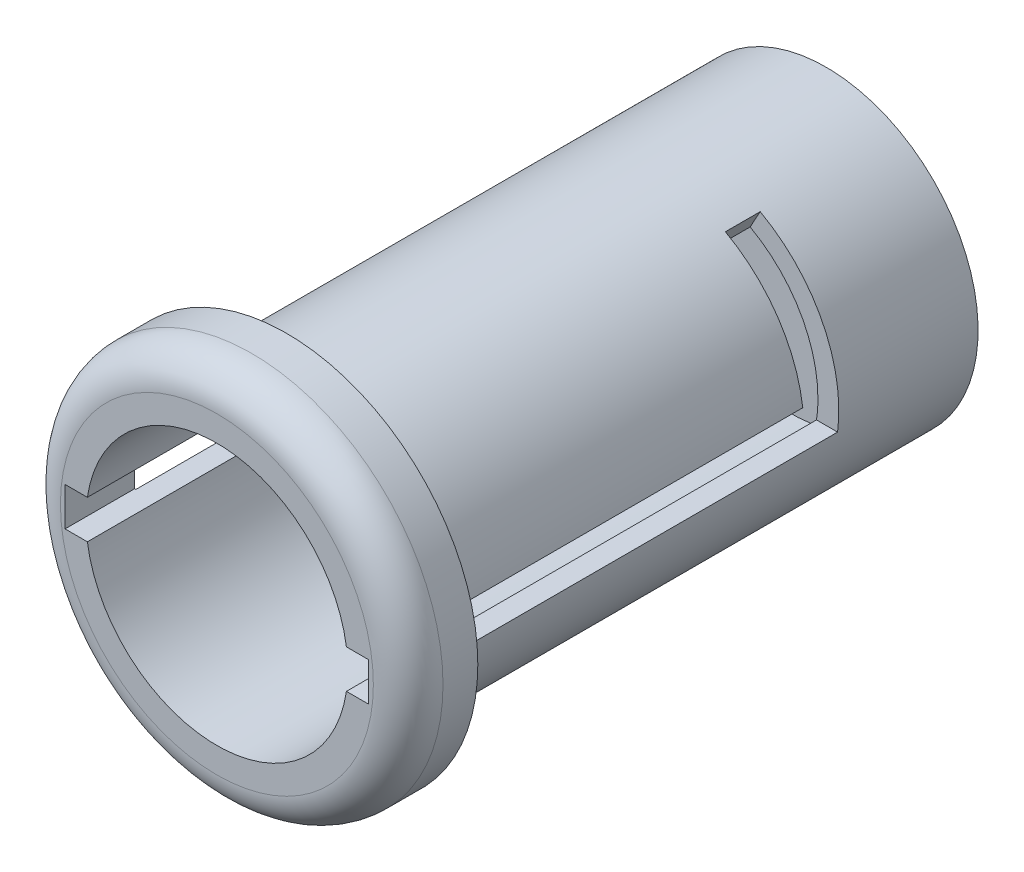
ISO-10303-21;
HEADER;
FILE_DESCRIPTION(('STEP AP214'),'2;1');
FILE_NAME('part.step','',(''),(''),'','','');
FILE_SCHEMA(('AUTOMOTIVE_DESIGN { 1 0 10303 214 1 1 1 1 }'));
ENDSEC;
DATA;
#1=APPLICATION_CONTEXT('core data for automotive mechanical design processes');
#2=APPLICATION_PROTOCOL_DEFINITION('international standard','automotive_design',2000,#1);
#3=PRODUCT_CONTEXT('',#1,'mechanical');
#4=PRODUCT('Part','Part','',(#3));
#5=PRODUCT_RELATED_PRODUCT_CATEGORY('part','',(#4));
#6=PRODUCT_DEFINITION_FORMATION('','',#4);
#7=PRODUCT_DEFINITION_CONTEXT('part definition',#1,'design');
#8=PRODUCT_DEFINITION('design','',#6,#7);
#9=PRODUCT_DEFINITION_SHAPE('','',#8);
#10=(LENGTH_UNIT() NAMED_UNIT(*) SI_UNIT(.MILLI.,.METRE.));
#11=(NAMED_UNIT(*) PLANE_ANGLE_UNIT() SI_UNIT($,.RADIAN.));
#12=(NAMED_UNIT(*) SI_UNIT($,.STERADIAN.) SOLID_ANGLE_UNIT());
#13=UNCERTAINTY_MEASURE_WITH_UNIT(LENGTH_MEASURE(1.E-05),#10,'distance_accuracy_value','');
#14=(GEOMETRIC_REPRESENTATION_CONTEXT(3) GLOBAL_UNCERTAINTY_ASSIGNED_CONTEXT((#13)) GLOBAL_UNIT_ASSIGNED_CONTEXT((#10,
#11,#12)) REPRESENTATION_CONTEXT('',''));
#15=CARTESIAN_POINT('',(0.,0.,0.));
#16=DIRECTION('',(0.,0.,1.));
#17=DIRECTION('',(1.,0.,0.));
#18=AXIS2_PLACEMENT_3D('',#15,#16,#17);
#19=CARTESIAN_POINT('',(-22.4709045039062,-26.2716583844857,-32.4096371527706));
#20=DIRECTION('',(0.,-1.,0.));
#21=DIRECTION('',(1.,0.,0.));
#22=AXIS2_PLACEMENT_3D('',#19,#20,#21);
#23=PLANE('',#22);
#24=DIRECTION('',(1.,0.,0.));
#25=VECTOR('',#24,1.);
#26=CARTESIAN_POINT('',(-22.4709045039062,-26.2716583844857,-25.5096371527706));
#27=LINE('',#26,#25);
#28=CARTESIAN_POINT('',(-23.9448998922446,-26.2716583844857,-25.5096371527706));
#29=VERTEX_POINT('',#28);
#30=CARTESIAN_POINT('',(-22.5518523622266,-26.2716583844857,-25.5096371527706));
#31=VERTEX_POINT('',#30);
#32=EDGE_CURVE('E168',#29,#31,#27,.T.);
#33=ORIENTED_EDGE('',*,*,#32,.F.);
#34=DIRECTION('',(0.,0.,1.));
#35=VECTOR('',#34,1.);
#36=CARTESIAN_POINT('',(-23.9448998922446,-26.2716583844857,-32.4096371527706));
#37=LINE('',#36,#35);
#38=CARTESIAN_POINT('',(-23.9448998922446,-26.2716583844857,5.54036284722943));
#39=VERTEX_POINT('',#38);
#40=EDGE_CURVE('E232',#39,#29,#37,.F.);
#41=ORIENTED_EDGE('',*,*,#40,.F.);
#42=DIRECTION('',(1.,0.,0.));
#43=VECTOR('',#42,1.);
#44=CARTESIAN_POINT('',(-22.4709045039062,-26.2716583844857,5.54036284722943));
#45=LINE('',#44,#43);
#46=CARTESIAN_POINT('',(-22.4709045039062,-26.2716583844857,5.54036284722943));
#47=VERTEX_POINT('',#46);
#48=EDGE_CURVE('E246',#39,#47,#45,.T.);
#49=ORIENTED_EDGE('',*,*,#48,.T.);
#50=DIRECTION('',(0.,0.,1.));
#51=VECTOR('',#50,1.);
#52=CARTESIAN_POINT('',(-22.4709045039062,-26.2716583844857,-32.4096371527706));
#53=LINE('',#52,#51);
#54=CARTESIAN_POINT('',(-22.4709045039062,-26.2716583844857,0.940362847229432));
#55=VERTEX_POINT('',#54);
#56=EDGE_CURVE('E268',#55,#47,#53,.T.);
#57=ORIENTED_EDGE('',*,*,#56,.F.);
#58=DIRECTION('',(1.,0.,0.));
#59=VECTOR('',#58,1.);
#60=CARTESIAN_POINT('',(-32.5,-26.2716583844857,0.940362847229432));
#61=LINE('',#60,#59);
#62=CARTESIAN_POINT('',(-22.5518523622266,-26.2716583844857,0.940362847229431));
#63=VERTEX_POINT('',#62);
#64=EDGE_CURVE('E200',#63,#55,#61,.T.);
#65=ORIENTED_EDGE('',*,*,#64,.F.);
#66=DIRECTION('',(0.,0.,1.));
#67=VECTOR('',#66,1.);
#68=CARTESIAN_POINT('',(-22.5518523622266,-26.2716583844857,-32.4096371527706));
#69=LINE('',#68,#67);
#70=EDGE_CURVE('E227',#63,#31,#69,.F.);
#71=ORIENTED_EDGE('',*,*,#70,.T.);
#72=EDGE_LOOP('',(#33,#41,#49,#57,#65,#71));
#73=FACE_BOUND('',#72,.T.);
#74=ADVANCED_FACE('F35',(#73),#23,.F.);
#75=CARTESIAN_POINT('',(-22.4709045039062,-23.7283416155143,-32.4096371527706));
#76=DIRECTION('',(0.,1.,0.));
#77=DIRECTION('',(0.,0.,1.));
#78=AXIS2_PLACEMENT_3D('',#75,#76,#77);
#79=PLANE('',#78);
#80=DIRECTION('',(-1.,0.,0.));
#81=VECTOR('',#80,1.);
#82=CARTESIAN_POINT('',(-22.4709045039062,-23.7283416155143,-25.5096371527706));
#83=LINE('',#82,#81);
#84=CARTESIAN_POINT('',(-41.0551001077554,-23.7283416155143,-25.5096371527706));
#85=VERTEX_POINT('',#84);
#86=CARTESIAN_POINT('',(-42.4481476377734,-23.7283416155143,-25.5096371527706));
#87=VERTEX_POINT('',#86);
#88=EDGE_CURVE('E153',#85,#87,#83,.T.);
#89=ORIENTED_EDGE('',*,*,#88,.F.);
#90=DIRECTION('',(0.,0.,1.));
#91=VECTOR('',#90,1.);
#92=CARTESIAN_POINT('',(-41.0551001077554,-23.7283416155143,-32.4096371527706));
#93=LINE('',#92,#91);
#94=CARTESIAN_POINT('',(-41.0551001077554,-23.7283416155143,5.54036284722943));
#95=VERTEX_POINT('',#94);
#96=EDGE_CURVE('E164',#95,#85,#93,.F.);
#97=ORIENTED_EDGE('',*,*,#96,.F.);
#98=DIRECTION('',(-1.,0.,0.));
#99=VECTOR('',#98,1.);
#100=CARTESIAN_POINT('',(-22.4709045039062,-23.7283416155143,5.54036284722943));
#101=LINE('',#100,#99);
#102=CARTESIAN_POINT('',(-42.5290954960938,-23.7283416155143,5.54036284722943));
#103=VERTEX_POINT('',#102);
#104=EDGE_CURVE('E259',#95,#103,#101,.T.);
#105=ORIENTED_EDGE('',*,*,#104,.T.);
#106=DIRECTION('',(0.,0.,1.));
#107=VECTOR('',#106,1.);
#108=CARTESIAN_POINT('',(-42.5290954960938,-23.7283416155143,-32.4096371527706));
#109=LINE('',#108,#107);
#110=CARTESIAN_POINT('',(-42.5290954960938,-23.7283416155143,0.940362847229431));
#111=VERTEX_POINT('',#110);
#112=EDGE_CURVE('E264',#111,#103,#109,.T.);
#113=ORIENTED_EDGE('',*,*,#112,.F.);
#114=DIRECTION('',(-1.,0.,0.));
#115=VECTOR('',#114,1.);
#116=CARTESIAN_POINT('',(-32.5,-23.7283416155143,0.940362847229432));
#117=LINE('',#116,#115);
#118=CARTESIAN_POINT('',(-42.4481476377734,-23.7283416155143,0.940362847229431));
#119=VERTEX_POINT('',#118);
#120=EDGE_CURVE('E43',#119,#111,#117,.T.);
#121=ORIENTED_EDGE('',*,*,#120,.F.);
#122=DIRECTION('',(0.,0.,1.));
#123=VECTOR('',#122,1.);
#124=CARTESIAN_POINT('',(-42.4481476377734,-23.7283416155143,-32.4096371527706));
#125=LINE('',#124,#123);
#126=EDGE_CURVE('E167',#119,#87,#125,.F.);
#127=ORIENTED_EDGE('',*,*,#126,.T.);
#128=EDGE_LOOP('',(#89,#97,#105,#113,#121,#127));
#129=FACE_BOUND('',#128,.T.);
#130=ADVANCED_FACE('F162',(#129),#79,.F.);
#131=CARTESIAN_POINT('',(-32.5,-25.,-32.4096371527706));
#132=DIRECTION('',(0.,0.,1.));
#133=DIRECTION('',(1.,0.,0.));
#134=AXIS2_PLACEMENT_3D('',#131,#132,#133);
#135=CYLINDRICAL_SURFACE('',#134,10.0290954960938);
#136=CARTESIAN_POINT('',(-32.5,-25.,-25.5096371527706));
#137=DIRECTION('',(0.,0.,1.));
#138=DIRECTION('',(-1.,0.,0.));
#139=AXIS2_PLACEMENT_3D('',#136,#137,#138);
#140=CIRCLE('',#139,10.0290954960938);
#141=CARTESIAN_POINT('',(-37.338518713134,-33.7847306806993,-25.5096371527706));
#142=VERTEX_POINT('',#141);
#143=EDGE_CURVE('E159',#87,#142,#140,.T.);
#144=ORIENTED_EDGE('',*,*,#143,.F.);
#145=ORIENTED_EDGE('',*,*,#126,.F.);
#146=CARTESIAN_POINT('',(-32.5,-25.,0.940362847229431));
#147=DIRECTION('',(0.,0.,1.));
#148=DIRECTION('',(1.,0.,0.));
#149=AXIS2_PLACEMENT_3D('',#146,#147,#148);
#150=CIRCLE('',#149,10.0290954960938);
#151=CARTESIAN_POINT('',(-22.5518523622266,-23.7283416155143,0.940362847229431));
#152=VERTEX_POINT('',#151);
#153=EDGE_CURVE('E180',#119,#152,#150,.F.);
#154=ORIENTED_EDGE('',*,*,#153,.T.);
#155=DIRECTION('',(0.,0.,1.));
#156=VECTOR('',#155,1.);
#157=CARTESIAN_POINT('',(-22.5518523622266,-23.7283416155143,-32.4096371527706));
#158=LINE('',#157,#156);
#159=CARTESIAN_POINT('',(-22.5518523622266,-23.7283416155143,-23.2096371527706));
#160=VERTEX_POINT('',#159);
#161=EDGE_CURVE('E182',#160,#152,#158,.T.);
#162=ORIENTED_EDGE('',*,*,#161,.F.);
#163=CARTESIAN_POINT('',(-32.5,-25.,-23.2096371527706));
#164=DIRECTION('',(0.,0.,1.));
#165=DIRECTION('',(1.,0.,0.));
#166=AXIS2_PLACEMENT_3D('',#163,#164,#165);
#167=CIRCLE('',#166,10.0290954960938);
#168=CARTESIAN_POINT('',(-27.661481286866,-16.2152693193007,-23.2096371527706));
#169=VERTEX_POINT('',#168);
#170=EDGE_CURVE('E58',#160,#169,#167,.T.);
#171=ORIENTED_EDGE('',*,*,#170,.T.);
#172=DIRECTION('',(0.,0.,1.));
#173=VECTOR('',#172,1.);
#174=CARTESIAN_POINT('',(-27.661481286866,-16.2152693193007,-25.5096371527706));
#175=LINE('',#174,#173);
#176=CARTESIAN_POINT('',(-27.661481286866,-16.2152693193007,-25.5096371527706));
#177=VERTEX_POINT('',#176);
#178=EDGE_CURVE('E298',#177,#169,#175,.T.);
#179=ORIENTED_EDGE('',*,*,#178,.F.);
#180=CARTESIAN_POINT('',(-32.5,-25.,-25.5096371527706));
#181=DIRECTION('',(0.,0.,1.));
#182=DIRECTION('',(1.,0.,0.));
#183=AXIS2_PLACEMENT_3D('',#180,#181,#182);
#184=CIRCLE('',#183,10.0290954960938);
#185=EDGE_CURVE('E290',#31,#177,#184,.T.);
#186=ORIENTED_EDGE('',*,*,#185,.F.);
#187=ORIENTED_EDGE('',*,*,#70,.F.);
#188=CARTESIAN_POINT('',(-42.4481476377734,-26.2716583844857,0.940362847229431));
#189=VERTEX_POINT('',#188);
#190=EDGE_CURVE('E188',#63,#189,#150,.F.);
#191=ORIENTED_EDGE('',*,*,#190,.T.);
#192=DIRECTION('',(0.,0.,1.));
#193=VECTOR('',#192,1.);
#194=CARTESIAN_POINT('',(-42.4481476377734,-26.2716583844857,-32.4096371527706));
#195=LINE('',#194,#193);
#196=CARTESIAN_POINT('',(-42.4481476377734,-26.2716583844857,-23.2096371527706));
#197=VERTEX_POINT('',#196);
#198=EDGE_CURVE('E225',#197,#189,#195,.T.);
#199=ORIENTED_EDGE('',*,*,#198,.F.);
#200=CARTESIAN_POINT('',(-32.5,-25.,-23.2096371527706));
#201=DIRECTION('',(0.,0.,1.));
#202=DIRECTION('',(-1.,0.,0.));
#203=AXIS2_PLACEMENT_3D('',#200,#201,#202);
#204=CIRCLE('',#203,10.0290954960938);
#205=CARTESIAN_POINT('',(-37.338518713134,-33.7847306806993,-23.2096371527706));
#206=VERTEX_POINT('',#205);
#207=EDGE_CURVE('E50',#197,#206,#204,.T.);
#208=ORIENTED_EDGE('',*,*,#207,.T.);
#209=DIRECTION('',(0.,0.,1.));
#210=VECTOR('',#209,1.);
#211=CARTESIAN_POINT('',(-37.338518713134,-33.7847306806993,-25.5096371527706));
#212=LINE('',#211,#210);
#213=EDGE_CURVE('E284',#142,#206,#212,.T.);
#214=ORIENTED_EDGE('',*,*,#213,.F.);
#215=EDGE_LOOP('',(#144,#145,#154,#162,#171,#179,#186,#187,#191,#199,#208,#214));
#216=FACE_BOUND('',#215,.T.);
#217=CARTESIAN_POINT('',(-32.5,-25.,-34.7096371527706));
#218=DIRECTION('',(0.,0.,-1.));
#219=DIRECTION('',(-1.,0.,0.));
#220=AXIS2_PLACEMENT_3D('',#217,#218,#219);
#221=CIRCLE('',#220,10.0290954960938);
#222=CARTESIAN_POINT('',(-42.5290954960938,-25.,-34.7096371527706));
#223=VERTEX_POINT('',#222);
#224=EDGE_CURVE('E169',#223,#223,#221,.T.);
#225=ORIENTED_EDGE('',*,*,#224,.F.);
#226=EDGE_LOOP('',(#225));
#227=FACE_BOUND('',#226,.T.);
#228=ADVANCED_FACE('F223',(#216,#227),#135,.T.);
#229=CARTESIAN_POINT('',(-32.5,-25.,-32.4096371527706));
#230=DIRECTION('',(0.,0.,1.));
#231=DIRECTION('',(1.,0.,0.));
#232=AXIS2_PLACEMENT_3D('',#229,#230,#231);
#233=CYLINDRICAL_SURFACE('',#232,8.64909549609379);
#234=ORIENTED_EDGE('',*,*,#96,.T.);
#235=CARTESIAN_POINT('',(-32.5,-25.,-25.5096371527706));
#236=DIRECTION('',(0.,0.,-1.));
#237=DIRECTION('',(-1.,0.,0.));
#238=AXIS2_PLACEMENT_3D('',#235,#236,#237);
#239=CIRCLE('',#238,8.6490954960938);
#240=CARTESIAN_POINT('',(-36.6727402461999,-32.5759548400379,-25.5096371527706));
#241=VERTEX_POINT('',#240);
#242=EDGE_CURVE('E149',#241,#85,#239,.T.);
#243=ORIENTED_EDGE('',*,*,#242,.F.);
#244=DIRECTION('',(0.,0.,1.));
#245=VECTOR('',#244,1.);
#246=CARTESIAN_POINT('',(-36.6727402461999,-32.5759548400379,-25.5096371527706));
#247=LINE('',#246,#245);
#248=CARTESIAN_POINT('',(-36.6727402461999,-32.5759548400379,-23.2096371527706));
#249=VERTEX_POINT('',#248);
#250=EDGE_CURVE('E318',#241,#249,#247,.T.);
#251=ORIENTED_EDGE('',*,*,#250,.T.);
#252=CARTESIAN_POINT('',(-32.5,-25.,-23.2096371527706));
#253=DIRECTION('',(0.,0.,-1.));
#254=DIRECTION('',(-1.,0.,0.));
#255=AXIS2_PLACEMENT_3D('',#252,#253,#254);
#256=CIRCLE('',#255,8.6490954960938);
#257=CARTESIAN_POINT('',(-41.0551001077554,-26.2716583844857,-23.2096371527706));
#258=VERTEX_POINT('',#257);
#259=EDGE_CURVE('E317',#249,#258,#256,.T.);
#260=ORIENTED_EDGE('',*,*,#259,.T.);
#261=DIRECTION('',(0.,0.,1.));
#262=VECTOR('',#261,1.);
#263=CARTESIAN_POINT('',(-41.0551001077554,-26.2716583844857,-32.4096371527706));
#264=LINE('',#263,#262);
#265=CARTESIAN_POINT('',(-41.0551001077554,-26.2716583844857,5.54036284722943));
#266=VERTEX_POINT('',#265);
#267=EDGE_CURVE('E235',#258,#266,#264,.T.);
#268=ORIENTED_EDGE('',*,*,#267,.T.);
#269=CARTESIAN_POINT('',(-32.5,-25.,5.54036284722943));
#270=DIRECTION('',(0.,0.,1.));
#271=DIRECTION('',(1.,0.,0.));
#272=AXIS2_PLACEMENT_3D('',#269,#270,#271);
#273=CIRCLE('',#272,8.64909549609379);
#274=EDGE_CURVE('E191',#266,#39,#273,.T.);
#275=ORIENTED_EDGE('',*,*,#274,.T.);
#276=ORIENTED_EDGE('',*,*,#40,.T.);
#277=CARTESIAN_POINT('',(-32.5,-25.,-25.5096371527706));
#278=DIRECTION('',(0.,0.,-1.));
#279=DIRECTION('',(1.,0.,0.));
#280=AXIS2_PLACEMENT_3D('',#277,#278,#279);
#281=CIRCLE('',#280,8.6490954960938);
#282=CARTESIAN_POINT('',(-28.3272597538001,-17.4240451599622,-25.5096371527706));
#283=VERTEX_POINT('',#282);
#284=EDGE_CURVE('E296',#283,#29,#281,.T.);
#285=ORIENTED_EDGE('',*,*,#284,.F.);
#286=DIRECTION('',(0.,0.,1.));
#287=VECTOR('',#286,1.);
#288=CARTESIAN_POINT('',(-28.3272597538001,-17.4240451599622,-25.5096371527706));
#289=LINE('',#288,#287);
#290=CARTESIAN_POINT('',(-28.3272597538001,-17.4240451599622,-23.2096371527706));
#291=VERTEX_POINT('',#290);
#292=EDGE_CURVE('E254',#283,#291,#289,.T.);
#293=ORIENTED_EDGE('',*,*,#292,.T.);
#294=CARTESIAN_POINT('',(-32.5,-25.,-23.2096371527706));
#295=DIRECTION('',(0.,0.,-1.));
#296=DIRECTION('',(1.,0.,0.));
#297=AXIS2_PLACEMENT_3D('',#294,#295,#296);
#298=CIRCLE('',#297,8.6490954960938);
#299=CARTESIAN_POINT('',(-23.9448998922446,-23.7283416155143,-23.2096371527706));
#300=VERTEX_POINT('',#299);
#301=EDGE_CURVE('E293',#291,#300,#298,.T.);
#302=ORIENTED_EDGE('',*,*,#301,.T.);
#303=DIRECTION('',(0.,0.,1.));
#304=VECTOR('',#303,1.);
#305=CARTESIAN_POINT('',(-23.9448998922446,-23.7283416155143,-32.4096371527706));
#306=LINE('',#305,#304);
#307=CARTESIAN_POINT('',(-23.9448998922446,-23.7283416155143,5.54036284722943));
#308=VERTEX_POINT('',#307);
#309=EDGE_CURVE('E177',#300,#308,#306,.T.);
#310=ORIENTED_EDGE('',*,*,#309,.T.);
#311=EDGE_CURVE('E175',#308,#95,#273,.T.);
#312=ORIENTED_EDGE('',*,*,#311,.T.);
#313=EDGE_LOOP('',(#234,#243,#251,#260,#268,#275,#276,#285,#293,#302,#310,#312));
#314=FACE_BOUND('',#313,.T.);
#315=CARTESIAN_POINT('',(-32.5,-25.,-32.4096371527706));
#316=DIRECTION('',(0.,0.,1.));
#317=DIRECTION('',(1.,0.,0.));
#318=AXIS2_PLACEMENT_3D('',#315,#316,#317);
#319=CIRCLE('',#318,8.64909549609379);
#320=CARTESIAN_POINT('',(-23.8509045039062,-25.,-32.4096371527706));
#321=VERTEX_POINT('',#320);
#322=EDGE_CURVE('E190',#321,#321,#319,.T.);
#323=ORIENTED_EDGE('',*,*,#322,.F.);
#324=EDGE_LOOP('',(#323));
#325=FACE_BOUND('',#324,.T.);
#326=ADVANCED_FACE('F172',(#314,#325),#233,.F.);
#327=CARTESIAN_POINT('',(-32.5,-25.,5.54036284722943));
#328=DIRECTION('',(0.,0.,1.));
#329=DIRECTION('',(1.,0.,0.));
#330=AXIS2_PLACEMENT_3D('',#327,#328,#329);
#331=PLANE('',#330);
#332=ORIENTED_EDGE('',*,*,#104,.F.);
#333=ORIENTED_EDGE('',*,*,#311,.F.);
#334=CARTESIAN_POINT('',(-22.4709045039062,-23.7283416155143,5.54036284722943));
#335=VERTEX_POINT('',#334);
#336=EDGE_CURVE('E260',#335,#308,#101,.T.);
#337=ORIENTED_EDGE('',*,*,#336,.F.);
#338=DIRECTION('',(0.,1.,0.));
#339=VECTOR('',#338,1.);
#340=CARTESIAN_POINT('',(-22.4709045039062,-23.7283416155143,5.54036284722943));
#341=LINE('',#340,#339);
#342=EDGE_CURVE('E249',#47,#335,#341,.T.);
#343=ORIENTED_EDGE('',*,*,#342,.F.);
#344=ORIENTED_EDGE('',*,*,#48,.F.);
#345=ORIENTED_EDGE('',*,*,#274,.F.);
#346=CARTESIAN_POINT('',(-42.5290954960938,-26.2716583844857,5.54036284722943));
#347=VERTEX_POINT('',#346);
#348=EDGE_CURVE('E243',#347,#266,#45,.T.);
#349=ORIENTED_EDGE('',*,*,#348,.F.);
#350=DIRECTION('',(0.,-1.,0.));
#351=VECTOR('',#350,1.);
#352=CARTESIAN_POINT('',(-42.5290954960938,-23.7283416155143,5.54036284722943));
#353=LINE('',#352,#351);
#354=EDGE_CURVE('E251',#103,#347,#353,.T.);
#355=ORIENTED_EDGE('',*,*,#354,.F.);
#356=EDGE_LOOP('',(#332,#333,#337,#343,#344,#345,#349,#355));
#357=FACE_BOUND('',#356,.T.);
#358=CARTESIAN_POINT('',(-32.5,-25.,5.54036284722943));
#359=DIRECTION('',(0.,0.,1.));
#360=DIRECTION('',(1.,0.,0.));
#361=AXIS2_PLACEMENT_3D('',#358,#359,#360);
#362=CIRCLE('',#361,10.3350964360413);
#363=CARTESIAN_POINT('',(-22.1649035639587,-25.,5.54036284722943));
#364=VERTEX_POINT('',#363);
#365=EDGE_CURVE('E194',#364,#364,#362,.T.);
#366=ORIENTED_EDGE('',*,*,#365,.T.);
#367=EDGE_LOOP('',(#366));
#368=FACE_BOUND('',#367,.T.);
#369=ADVANCED_FACE('F240',(#357,#368),#331,.T.);
#370=CARTESIAN_POINT('',(-32.5,-25.,0.940362847229432));
#371=DIRECTION('',(0.,0.,1.));
#372=DIRECTION('',(1.,0.,0.));
#373=AXIS2_PLACEMENT_3D('',#370,#371,#372);
#374=CYLINDRICAL_SURFACE('',#373,12.6350964360413);
#375=CARTESIAN_POINT('',(-32.5,-25.,3.24036284722943));
#376=DIRECTION('',(0.,0.,1.));
#377=DIRECTION('',(1.,0.,0.));
#378=AXIS2_PLACEMENT_3D('',#375,#376,#377);
#379=CIRCLE('',#378,12.6350964360413);
#380=CARTESIAN_POINT('',(-19.8649035639587,-25.,3.24036284722943));
#381=VERTEX_POINT('',#380);
#382=EDGE_CURVE('E197',#381,#381,#379,.F.);
#383=ORIENTED_EDGE('',*,*,#382,.T.);
#384=EDGE_LOOP('',(#383));
#385=FACE_BOUND('',#384,.T.);
#386=CARTESIAN_POINT('',(-32.5,-25.,0.940362847229432));
#387=DIRECTION('',(0.,0.,1.));
#388=DIRECTION('',(1.,0.,0.));
#389=AXIS2_PLACEMENT_3D('',#386,#387,#388);
#390=CIRCLE('',#389,12.6350964360413);
#391=CARTESIAN_POINT('',(-19.8649035639587,-25.,0.940362847229432));
#392=VERTEX_POINT('',#391);
#393=EDGE_CURVE('E176',#392,#392,#390,.T.);
#394=ORIENTED_EDGE('',*,*,#393,.T.);
#395=EDGE_LOOP('',(#394));
#396=FACE_BOUND('',#395,.T.);
#397=ADVANCED_FACE('F361',(#385,#396),#374,.T.);
#398=CARTESIAN_POINT('',(-32.5,-25.,0.940362847229432));
#399=DIRECTION('',(0.,0.,1.));
#400=DIRECTION('',(1.,0.,0.));
#401=AXIS2_PLACEMENT_3D('',#398,#399,#400);
#402=PLANE('',#401);
#403=ORIENTED_EDGE('',*,*,#153,.F.);
#404=ORIENTED_EDGE('',*,*,#120,.T.);
#405=DIRECTION('',(0.,-1.,0.));
#406=VECTOR('',#405,1.);
#407=CARTESIAN_POINT('',(-42.5290954960938,-25.,0.940362847229432));
#408=LINE('',#407,#406);
#409=CARTESIAN_POINT('',(-42.5290954960938,-26.2716583844857,0.940362847229431));
#410=VERTEX_POINT('',#409);
#411=EDGE_CURVE('E208',#111,#410,#408,.T.);
#412=ORIENTED_EDGE('',*,*,#411,.T.);
#413=EDGE_CURVE('E204',#410,#189,#61,.T.);
#414=ORIENTED_EDGE('',*,*,#413,.T.);
#415=ORIENTED_EDGE('',*,*,#190,.F.);
#416=ORIENTED_EDGE('',*,*,#64,.T.);
#417=DIRECTION('',(0.,1.,0.));
#418=VECTOR('',#417,1.);
#419=CARTESIAN_POINT('',(-22.4709045039062,-25.,0.940362847229432));
#420=LINE('',#419,#418);
#421=CARTESIAN_POINT('',(-22.4709045039062,-23.7283416155143,0.940362847229431));
#422=VERTEX_POINT('',#421);
#423=EDGE_CURVE('E203',#55,#422,#420,.T.);
#424=ORIENTED_EDGE('',*,*,#423,.T.);
#425=EDGE_CURVE('E206',#422,#152,#117,.T.);
#426=ORIENTED_EDGE('',*,*,#425,.T.);
#427=EDGE_LOOP('',(#403,#404,#412,#414,#415,#416,#424,#426));
#428=FACE_BOUND('',#427,.T.);
#429=ORIENTED_EDGE('',*,*,#393,.F.);
#430=EDGE_LOOP('',(#429));
#431=FACE_BOUND('',#430,.T.);
#432=ADVANCED_FACE('F216',(#428,#431),#402,.F.);
#433=CARTESIAN_POINT('',(-32.5,-25.,3.24036284722943));
#434=DIRECTION('',(0.,0.,1.));
#435=DIRECTION('',(1.,0.,0.));
#436=AXIS2_PLACEMENT_3D('',#433,#434,#435);
#437=TOROIDAL_SURFACE('',#436,10.3350964360413,2.3);
#438=ORIENTED_EDGE('',*,*,#382,.F.);
#439=EDGE_LOOP('',(#438));
#440=FACE_BOUND('',#439,.T.);
#441=ORIENTED_EDGE('',*,*,#365,.F.);
#442=EDGE_LOOP('',(#441));
#443=FACE_BOUND('',#442,.T.);
#444=ADVANCED_FACE('F37',(#440,#443),#437,.T.);
#445=CARTESIAN_POINT('',(-22.4709045039062,-23.7283416155143,-32.4096371527706));
#446=DIRECTION('',(1.,0.,0.));
#447=DIRECTION('',(0.,0.,-1.));
#448=AXIS2_PLACEMENT_3D('',#445,#446,#447);
#449=PLANE('',#448);
#450=ORIENTED_EDGE('',*,*,#56,.T.);
#451=ORIENTED_EDGE('',*,*,#342,.T.);
#452=DIRECTION('',(0.,0.,1.));
#453=VECTOR('',#452,1.);
#454=CARTESIAN_POINT('',(-22.4709045039062,-23.7283416155143,-32.4096371527706));
#455=LINE('',#454,#453);
#456=EDGE_CURVE('E266',#422,#335,#455,.T.);
#457=ORIENTED_EDGE('',*,*,#456,.F.);
#458=ORIENTED_EDGE('',*,*,#423,.F.);
#459=EDGE_LOOP('',(#450,#451,#457,#458));
#460=FACE_BOUND('',#459,.T.);
#461=ADVANCED_FACE('F357',(#460),#449,.F.);
#462=ORIENTED_EDGE('',*,*,#309,.F.);
#463=DIRECTION('',(1.,0.,0.));
#464=VECTOR('',#463,1.);
#465=CARTESIAN_POINT('',(-22.4709045039062,-23.7283416155143,-23.2096371527706));
#466=LINE('',#465,#464);
#467=EDGE_CURVE('E11',#300,#160,#466,.T.);
#468=ORIENTED_EDGE('',*,*,#467,.T.);
#469=ORIENTED_EDGE('',*,*,#161,.T.);
#470=ORIENTED_EDGE('',*,*,#425,.F.);
#471=ORIENTED_EDGE('',*,*,#456,.T.);
#472=ORIENTED_EDGE('',*,*,#336,.T.);
#473=EDGE_LOOP('',(#462,#468,#469,#470,#471,#472));
#474=FACE_BOUND('',#473,.T.);
#475=ADVANCED_FACE('F279',(#474),#79,.F.);
#476=CARTESIAN_POINT('',(-42.5290954960938,-23.7283416155143,-32.4096371527706));
#477=DIRECTION('',(-1.,0.,0.));
#478=DIRECTION('',(0.,0.,1.));
#479=AXIS2_PLACEMENT_3D('',#476,#477,#478);
#480=PLANE('',#479);
#481=ORIENTED_EDGE('',*,*,#112,.T.);
#482=ORIENTED_EDGE('',*,*,#354,.T.);
#483=DIRECTION('',(0.,0.,1.));
#484=VECTOR('',#483,1.);
#485=CARTESIAN_POINT('',(-42.5290954960938,-26.2716583844857,-32.4096371527706));
#486=LINE('',#485,#484);
#487=EDGE_CURVE('E263',#410,#347,#486,.T.);
#488=ORIENTED_EDGE('',*,*,#487,.F.);
#489=ORIENTED_EDGE('',*,*,#411,.F.);
#490=EDGE_LOOP('',(#481,#482,#488,#489));
#491=FACE_BOUND('',#490,.T.);
#492=ADVANCED_FACE('F313',(#491),#480,.F.);
#493=ORIENTED_EDGE('',*,*,#267,.F.);
#494=DIRECTION('',(-1.,0.,0.));
#495=VECTOR('',#494,1.);
#496=CARTESIAN_POINT('',(-42.5290954960938,-26.2716583844857,-23.2096371527706));
#497=LINE('',#496,#495);
#498=EDGE_CURVE('E285',#258,#197,#497,.T.);
#499=ORIENTED_EDGE('',*,*,#498,.T.);
#500=ORIENTED_EDGE('',*,*,#198,.T.);
#501=ORIENTED_EDGE('',*,*,#413,.F.);
#502=ORIENTED_EDGE('',*,*,#487,.T.);
#503=ORIENTED_EDGE('',*,*,#348,.T.);
#504=EDGE_LOOP('',(#493,#499,#500,#501,#502,#503));
#505=FACE_BOUND('',#504,.T.);
#506=ADVANCED_FACE('F314',(#505),#23,.F.);
#507=CARTESIAN_POINT('',(-32.5,-25.,-25.5096371527706));
#508=DIRECTION('',(0.,0.,1.));
#509=DIRECTION('',(1.,0.,0.));
#510=AXIS2_PLACEMENT_3D('',#507,#508,#509);
#511=PLANE('',#510);
#512=ORIENTED_EDGE('',*,*,#284,.T.);
#513=ORIENTED_EDGE('',*,*,#32,.T.);
#514=ORIENTED_EDGE('',*,*,#185,.T.);
#515=DIRECTION('',(-0.482448164444999,-0.875924522218468,0.));
#516=VECTOR('',#515,1.);
#517=CARTESIAN_POINT('',(-27.661481286866,-16.2152693193007,-25.5096371527706));
#518=LINE('',#517,#516);
#519=EDGE_CURVE('E292',#177,#283,#518,.T.);
#520=ORIENTED_EDGE('',*,*,#519,.T.);
#521=EDGE_LOOP('',(#512,#513,#514,#520));
#522=FACE_BOUND('',#521,.T.);
#523=ADVANCED_FACE('F347',(#522),#511,.T.);
#524=CARTESIAN_POINT('',(-32.5,-25.,-23.2096371527706));
#525=DIRECTION('',(0.,0.,1.));
#526=DIRECTION('',(1.,0.,0.));
#527=AXIS2_PLACEMENT_3D('',#524,#525,#526);
#528=PLANE('',#527);
#529=ORIENTED_EDGE('',*,*,#301,.F.);
#530=DIRECTION('',(-0.482448164444999,-0.875924522218468,0.));
#531=VECTOR('',#530,1.);
#532=CARTESIAN_POINT('',(-27.661481286866,-16.2152693193007,-23.2096371527706));
#533=LINE('',#532,#531);
#534=EDGE_CURVE('E300',#169,#291,#533,.T.);
#535=ORIENTED_EDGE('',*,*,#534,.F.);
#536=ORIENTED_EDGE('',*,*,#170,.F.);
#537=ORIENTED_EDGE('',*,*,#467,.F.);
#538=EDGE_LOOP('',(#529,#535,#536,#537));
#539=FACE_BOUND('',#538,.T.);
#540=ADVANCED_FACE('F310',(#539),#528,.F.);
#541=CARTESIAN_POINT('',(-27.661481286866,-16.2152693193007,-25.5096371527706));
#542=DIRECTION('',(-0.875924522218468,0.482448164444999,0.));
#543=DIRECTION('',(-0.482448164444999,-0.875924522218468,0.));
#544=AXIS2_PLACEMENT_3D('',#541,#542,#543);
#545=PLANE('',#544);
#546=ORIENTED_EDGE('',*,*,#534,.T.);
#547=ORIENTED_EDGE('',*,*,#292,.F.);
#548=ORIENTED_EDGE('',*,*,#519,.F.);
#549=ORIENTED_EDGE('',*,*,#178,.T.);
#550=EDGE_LOOP('',(#546,#547,#548,#549));
#551=FACE_BOUND('',#550,.T.);
#552=ADVANCED_FACE('F309',(#551),#545,.F.);
#553=CARTESIAN_POINT('',(-32.5,-25.,-25.5096371527706));
#554=DIRECTION('',(0.,0.,1.));
#555=DIRECTION('',(-1.,0.,0.));
#556=AXIS2_PLACEMENT_3D('',#553,#554,#555);
#557=PLANE('',#556);
#558=ORIENTED_EDGE('',*,*,#242,.T.);
#559=ORIENTED_EDGE('',*,*,#88,.T.);
#560=ORIENTED_EDGE('',*,*,#143,.T.);
#561=DIRECTION('',(0.482448164444999,0.875924522218468,0.));
#562=VECTOR('',#561,1.);
#563=CARTESIAN_POINT('',(-37.338518713134,-33.7847306806993,-25.5096371527706));
#564=LINE('',#563,#562);
#565=EDGE_CURVE('E155',#142,#241,#564,.T.);
#566=ORIENTED_EDGE('',*,*,#565,.T.);
#567=EDGE_LOOP('',(#558,#559,#560,#566));
#568=FACE_BOUND('',#567,.T.);
#569=ADVANCED_FACE('F151',(#568),#557,.T.);
#570=CARTESIAN_POINT('',(-32.5,-25.,-23.2096371527706));
#571=DIRECTION('',(0.,0.,1.));
#572=DIRECTION('',(-1.,0.,0.));
#573=AXIS2_PLACEMENT_3D('',#570,#571,#572);
#574=PLANE('',#573);
#575=ORIENTED_EDGE('',*,*,#259,.F.);
#576=DIRECTION('',(0.482448164444999,0.875924522218468,0.));
#577=VECTOR('',#576,1.);
#578=CARTESIAN_POINT('',(-37.338518713134,-33.7847306806993,-23.2096371527706));
#579=LINE('',#578,#577);
#580=EDGE_CURVE('E323',#206,#249,#579,.T.);
#581=ORIENTED_EDGE('',*,*,#580,.F.);
#582=ORIENTED_EDGE('',*,*,#207,.F.);
#583=ORIENTED_EDGE('',*,*,#498,.F.);
#584=EDGE_LOOP('',(#575,#581,#582,#583));
#585=FACE_BOUND('',#584,.T.);
#586=ADVANCED_FACE('F316',(#585),#574,.F.);
#587=CARTESIAN_POINT('',(-37.338518713134,-33.7847306806993,-25.5096371527706));
#588=DIRECTION('',(0.875924522218468,-0.482448164444999,0.));
#589=DIRECTION('',(0.482448164444999,0.875924522218468,0.));
#590=AXIS2_PLACEMENT_3D('',#587,#588,#589);
#591=PLANE('',#590);
#592=ORIENTED_EDGE('',*,*,#580,.T.);
#593=ORIENTED_EDGE('',*,*,#250,.F.);
#594=ORIENTED_EDGE('',*,*,#565,.F.);
#595=ORIENTED_EDGE('',*,*,#213,.T.);
#596=EDGE_LOOP('',(#592,#593,#594,#595));
#597=FACE_BOUND('',#596,.T.);
#598=ADVANCED_FACE('F444',(#597),#591,.F.);
#599=CARTESIAN_POINT('',(-32.5,-25.,-34.7096371527706));
#600=DIRECTION('',(0.,0.,-1.));
#601=DIRECTION('',(-1.,0.,0.));
#602=AXIS2_PLACEMENT_3D('',#599,#600,#601);
#603=PLANE('',#602);
#604=ORIENTED_EDGE('',*,*,#224,.T.);
#605=EDGE_LOOP('',(#604));
#606=FACE_BOUND('',#605,.T.);
#607=ADVANCED_FACE('F331',(#606),#603,.T.);
#608=CARTESIAN_POINT('',(-32.5,-25.,-32.4096371527706));
#609=DIRECTION('',(0.,0.,-1.));
#610=DIRECTION('',(-1.,0.,0.));
#611=AXIS2_PLACEMENT_3D('',#608,#609,#610);
#612=PLANE('',#611);
#613=ORIENTED_EDGE('',*,*,#322,.T.);
#614=EDGE_LOOP('',(#613));
#615=FACE_BOUND('',#614,.T.);
#616=ADVANCED_FACE('F462',(#615),#612,.F.);
#617=CLOSED_SHELL('',(#74,#130,#228,#326,#369,#397,#432,#444,#461,#475,#492,#506,#523,#540,#552,
#569,#586,#598,#607,#616));
#618=MANIFOLD_SOLID_BREP('B2',#617);
#619=ADVANCED_BREP_SHAPE_REPRESENTATION('',(#18,#618),#14);
#620=SHAPE_DEFINITION_REPRESENTATION(#9,#619);
ENDSEC;
END-ISO-10303-21;
